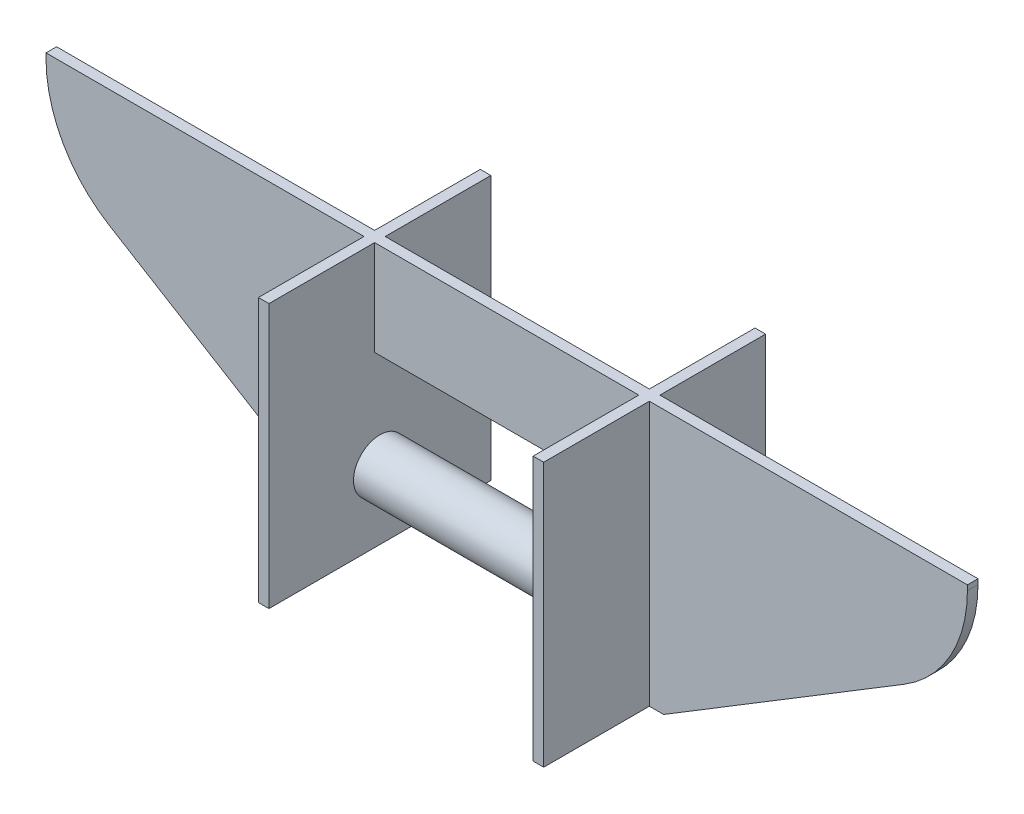
ISO-10303-21;
HEADER;
FILE_DESCRIPTION(('STEP AP214'),'2;1');
FILE_NAME('part.step','',(''),(''),'','','');
FILE_SCHEMA(('AUTOMOTIVE_DESIGN { 1 0 10303 214 1 1 1 1 }'));
ENDSEC;
DATA;
#1=APPLICATION_CONTEXT('core data for automotive mechanical design processes');
#2=APPLICATION_PROTOCOL_DEFINITION('international standard','automotive_design',2000,#1);
#3=PRODUCT_CONTEXT('',#1,'mechanical');
#4=PRODUCT('Part','Part','',(#3));
#5=PRODUCT_RELATED_PRODUCT_CATEGORY('part','',(#4));
#6=PRODUCT_DEFINITION_FORMATION('','',#4);
#7=PRODUCT_DEFINITION_CONTEXT('part definition',#1,'design');
#8=PRODUCT_DEFINITION('design','',#6,#7);
#9=PRODUCT_DEFINITION_SHAPE('','',#8);
#10=(LENGTH_UNIT() NAMED_UNIT(*) SI_UNIT(.MILLI.,.METRE.));
#11=(NAMED_UNIT(*) PLANE_ANGLE_UNIT() SI_UNIT($,.RADIAN.));
#12=(NAMED_UNIT(*) SI_UNIT($,.STERADIAN.) SOLID_ANGLE_UNIT());
#13=UNCERTAINTY_MEASURE_WITH_UNIT(LENGTH_MEASURE(1.E-05),#10,'distance_accuracy_value','');
#14=(GEOMETRIC_REPRESENTATION_CONTEXT(3) GLOBAL_UNCERTAINTY_ASSIGNED_CONTEXT((#13)) GLOBAL_UNIT_ASSIGNED_CONTEXT((#10,
#11,#12)) REPRESENTATION_CONTEXT('',''));
#15=CARTESIAN_POINT('',(0.,0.,0.));
#16=DIRECTION('',(0.,0.,1.));
#17=DIRECTION('',(1.,0.,0.));
#18=AXIS2_PLACEMENT_3D('',#15,#16,#17);
#19=CARTESIAN_POINT('',(107.188,124.586514185444,-2.54));
#20=DIRECTION('',(0.,0.,1.));
#21=DIRECTION('',(1.,0.,0.));
#22=AXIS2_PLACEMENT_3D('',#19,#20,#21);
#23=PLANE('',#22);
#24=DIRECTION('',(-1.,0.,0.));
#25=VECTOR('',#24,1.);
#26=CARTESIAN_POINT('',(-272.288,127.,-2.54));
#27=LINE('',#26,#25);
#28=CARTESIAN_POINT('',(12.7,127.,-2.54));
#29=VERTEX_POINT('',#28);
#30=CARTESIAN_POINT('',(-114.3,127.,-2.54));
#31=VERTEX_POINT('',#30);
#32=EDGE_CURVE('E398',#29,#31,#27,.T.);
#33=ORIENTED_EDGE('',*,*,#32,.F.);
#34=DIRECTION('',(0.,-1.,0.));
#35=VECTOR('',#34,1.);
#36=CARTESIAN_POINT('',(12.7,124.586514185444,-2.54));
#37=LINE('',#36,#35);
#38=CARTESIAN_POINT('',(12.7,81.28,-2.54));
#39=VERTEX_POINT('',#38);
#40=EDGE_CURVE('E274',#29,#39,#37,.T.);
#41=ORIENTED_EDGE('',*,*,#40,.T.);
#42=DIRECTION('',(1.,0.,0.));
#43=VECTOR('',#42,1.);
#44=CARTESIAN_POINT('',(-114.3,81.28,-2.54));
#45=LINE('',#44,#43);
#46=CARTESIAN_POINT('',(-114.3,81.28,-2.54));
#47=VERTEX_POINT('',#46);
#48=EDGE_CURVE('E373',#47,#39,#45,.T.);
#49=ORIENTED_EDGE('',*,*,#48,.F.);
#50=DIRECTION('',(0.,1.,0.));
#51=VECTOR('',#50,1.);
#52=CARTESIAN_POINT('',(-114.3,124.586514185444,-2.54));
#53=LINE('',#52,#51);
#54=EDGE_CURVE('E333',#47,#31,#53,.T.);
#55=ORIENTED_EDGE('',*,*,#54,.T.);
#56=EDGE_LOOP('',(#33,#41,#49,#55));
#57=FACE_BOUND('',#56,.T.);
#58=ADVANCED_FACE('F39',(#57),#23,.F.);
#59=CARTESIAN_POINT('',(107.188,124.586514185444,2.54));
#60=DIRECTION('',(0.,0.,1.));
#61=DIRECTION('',(1.,0.,0.));
#62=AXIS2_PLACEMENT_3D('',#59,#60,#61);
#63=PLANE('',#62);
#64=DIRECTION('',(0.,-1.,0.));
#65=VECTOR('',#64,1.);
#66=CARTESIAN_POINT('',(12.7,124.586514185444,2.54));
#67=LINE('',#66,#65);
#68=CARTESIAN_POINT('',(12.7,127.,2.54));
#69=VERTEX_POINT('',#68);
#70=CARTESIAN_POINT('',(12.7,81.28,2.54));
#71=VERTEX_POINT('',#70);
#72=EDGE_CURVE('E55',#69,#71,#67,.T.);
#73=ORIENTED_EDGE('',*,*,#72,.F.);
#74=DIRECTION('',(-1.,0.,0.));
#75=VECTOR('',#74,1.);
#76=CARTESIAN_POINT('',(-272.288,127.,2.54));
#77=LINE('',#76,#75);
#78=CARTESIAN_POINT('',(-114.3,127.,2.54));
#79=VERTEX_POINT('',#78);
#80=EDGE_CURVE('E358',#69,#79,#77,.T.);
#81=ORIENTED_EDGE('',*,*,#80,.T.);
#82=DIRECTION('',(0.,1.,0.));
#83=VECTOR('',#82,1.);
#84=CARTESIAN_POINT('',(-114.3,124.586514185444,2.54));
#85=LINE('',#84,#83);
#86=CARTESIAN_POINT('',(-114.3,81.28,2.54));
#87=VERTEX_POINT('',#86);
#88=EDGE_CURVE('E11',#87,#79,#85,.T.);
#89=ORIENTED_EDGE('',*,*,#88,.F.);
#90=DIRECTION('',(1.,0.,0.));
#91=VECTOR('',#90,1.);
#92=CARTESIAN_POINT('',(-114.3,81.28,2.54));
#93=LINE('',#92,#91);
#94=EDGE_CURVE('E337',#87,#71,#93,.T.);
#95=ORIENTED_EDGE('',*,*,#94,.T.);
#96=EDGE_LOOP('',(#73,#81,#89,#95));
#97=FACE_BOUND('',#96,.T.);
#98=ADVANCED_FACE('F501',(#97),#63,.T.);
#99=DIRECTION('',(1.,0.,0.));
#100=VECTOR('',#99,1.);
#101=CARTESIAN_POINT('',(12.7,0.,-2.54));
#102=LINE('',#101,#100);
#103=CARTESIAN_POINT('',(17.78,0.,-2.54));
#104=VERTEX_POINT('',#103);
#105=CARTESIAN_POINT('',(24.638,0.,-2.54));
#106=VERTEX_POINT('',#105);
#107=EDGE_CURVE('E377',#104,#106,#102,.T.);
#108=ORIENTED_EDGE('',*,*,#107,.F.);
#109=DIRECTION('',(0.,1.,0.));
#110=VECTOR('',#109,1.);
#111=CARTESIAN_POINT('',(17.78,124.586514185444,-2.54));
#112=LINE('',#111,#110);
#113=CARTESIAN_POINT('',(17.78,127.,-2.54));
#114=VERTEX_POINT('',#113);
#115=EDGE_CURVE('E280',#104,#114,#112,.T.);
#116=ORIENTED_EDGE('',*,*,#115,.T.);
#117=CARTESIAN_POINT('',(170.688,127.,-2.54));
#118=VERTEX_POINT('',#117);
#119=EDGE_CURVE('E393',#118,#114,#27,.T.);
#120=ORIENTED_EDGE('',*,*,#119,.F.);
#121=DIRECTION('',(0.,1.,0.));
#122=VECTOR('',#121,1.);
#123=CARTESIAN_POINT('',(170.688,124.586514185444,-2.54));
#124=LINE('',#123,#122);
#125=CARTESIAN_POINT('',(170.688,124.586514185444,-2.54));
#126=VERTEX_POINT('',#125);
#127=EDGE_CURVE('E388',#126,#118,#124,.T.);
#128=ORIENTED_EDGE('',*,*,#127,.F.);
#129=CARTESIAN_POINT('',(107.188,124.586514185444,-2.54));
#130=DIRECTION('',(0.,0.,1.));
#131=DIRECTION('',(1.,0.,0.));
#132=AXIS2_PLACEMENT_3D('',#129,#130,#131);
#133=CIRCLE('',#132,63.5);
#134=CARTESIAN_POINT('',(140.20463112788,70.3449059039269,-2.54));
#135=VERTEX_POINT('',#134);
#136=EDGE_CURVE('E384',#135,#126,#133,.T.);
#137=ORIENTED_EDGE('',*,*,#136,.F.);
#138=DIRECTION('',(0.854198555614438,0.519946946895746,0.));
#139=VECTOR('',#138,1.);
#140=CARTESIAN_POINT('',(24.638,0.,-2.54));
#141=LINE('',#140,#139);
#142=EDGE_CURVE('E380',#106,#135,#141,.T.);
#143=ORIENTED_EDGE('',*,*,#142,.F.);
#144=EDGE_LOOP('',(#108,#116,#120,#128,#137,#143));
#145=FACE_BOUND('',#144,.T.);
#146=ADVANCED_FACE('F525',(#145),#23,.F.);
#147=DIRECTION('',(0.,1.,0.));
#148=VECTOR('',#147,1.);
#149=CARTESIAN_POINT('',(17.78,124.586514185444,2.54));
#150=LINE('',#149,#148);
#151=CARTESIAN_POINT('',(17.78,0.,2.54));
#152=VERTEX_POINT('',#151);
#153=CARTESIAN_POINT('',(17.78,127.,2.54));
#154=VERTEX_POINT('',#153);
#155=EDGE_CURVE('E277',#152,#154,#150,.T.);
#156=ORIENTED_EDGE('',*,*,#155,.F.);
#157=DIRECTION('',(1.,0.,0.));
#158=VECTOR('',#157,1.);
#159=CARTESIAN_POINT('',(12.7,0.,2.54));
#160=LINE('',#159,#158);
#161=CARTESIAN_POINT('',(24.638,0.,2.54));
#162=VERTEX_POINT('',#161);
#163=EDGE_CURVE('E340',#152,#162,#160,.T.);
#164=ORIENTED_EDGE('',*,*,#163,.T.);
#165=DIRECTION('',(0.854198555614438,0.519946946895746,0.));
#166=VECTOR('',#165,1.);
#167=CARTESIAN_POINT('',(24.638,0.,2.54));
#168=LINE('',#167,#166);
#169=CARTESIAN_POINT('',(140.20463112788,70.3449059039269,2.54));
#170=VERTEX_POINT('',#169);
#171=EDGE_CURVE('E343',#162,#170,#168,.T.);
#172=ORIENTED_EDGE('',*,*,#171,.T.);
#173=CARTESIAN_POINT('',(107.188,124.586514185444,2.54));
#174=DIRECTION('',(0.,0.,1.));
#175=DIRECTION('',(1.,0.,0.));
#176=AXIS2_PLACEMENT_3D('',#173,#174,#175);
#177=CIRCLE('',#176,63.5);
#178=CARTESIAN_POINT('',(170.688,124.586514185444,2.54));
#179=VERTEX_POINT('',#178);
#180=EDGE_CURVE('E347',#170,#179,#177,.T.);
#181=ORIENTED_EDGE('',*,*,#180,.T.);
#182=DIRECTION('',(0.,1.,0.));
#183=VECTOR('',#182,1.);
#184=CARTESIAN_POINT('',(170.688,124.586514185444,2.54));
#185=LINE('',#184,#183);
#186=CARTESIAN_POINT('',(170.688,127.,2.54));
#187=VERTEX_POINT('',#186);
#188=EDGE_CURVE('E351',#179,#187,#185,.T.);
#189=ORIENTED_EDGE('',*,*,#188,.T.);
#190=EDGE_CURVE('E63',#187,#154,#77,.T.);
#191=ORIENTED_EDGE('',*,*,#190,.T.);
#192=EDGE_LOOP('',(#156,#164,#172,#181,#189,#191));
#193=FACE_BOUND('',#192,.T.);
#194=ADVANCED_FACE('F529',(#193),#63,.T.);
#195=CARTESIAN_POINT('',(-114.3,0.,-2.54));
#196=DIRECTION('',(1.,0.,0.));
#197=DIRECTION('',(0.,0.,-1.));
#198=AXIS2_PLACEMENT_3D('',#195,#196,#197);
#199=PLANE('',#198);
#200=CARTESIAN_POINT('',(-114.3,33.02,0.));
#201=DIRECTION('',(1.,0.,0.));
#202=DIRECTION('',(0.,0.,-1.));
#203=AXIS2_PLACEMENT_3D('',#200,#201,#202);
#204=CIRCLE('',#203,12.7);
#205=CARTESIAN_POINT('',(-114.3,33.02,-12.7));
#206=VERTEX_POINT('',#205);
#207=EDGE_CURVE('E235',#206,#206,#204,.T.);
#208=ORIENTED_EDGE('',*,*,#207,.F.);
#209=EDGE_LOOP('',(#208));
#210=FACE_BOUND('',#209,.T.);
#211=DIRECTION('',(0.,0.,1.));
#212=VECTOR('',#211,1.);
#213=CARTESIAN_POINT('',(-114.3,81.28,-2.54));
#214=LINE('',#213,#212);
#215=EDGE_CURVE('E414',#47,#87,#214,.T.);
#216=ORIENTED_EDGE('',*,*,#215,.T.);
#217=ORIENTED_EDGE('',*,*,#88,.T.);
#218=DIRECTION('',(0.,0.,1.));
#219=VECTOR('',#218,1.);
#220=CARTESIAN_POINT('',(-114.3,127.,-53.34));
#221=LINE('',#220,#219);
#222=CARTESIAN_POINT('',(-114.3,127.,53.34));
#223=VERTEX_POINT('',#222);
#224=EDGE_CURVE('E316',#79,#223,#221,.T.);
#225=ORIENTED_EDGE('',*,*,#224,.T.);
#226=DIRECTION('',(0.,1.,0.));
#227=VECTOR('',#226,1.);
#228=CARTESIAN_POINT('',(-114.3,0.,53.34));
#229=LINE('',#228,#227);
#230=CARTESIAN_POINT('',(-114.3,0.,53.34));
#231=VERTEX_POINT('',#230);
#232=EDGE_CURVE('E284',#231,#223,#229,.T.);
#233=ORIENTED_EDGE('',*,*,#232,.F.);
#234=DIRECTION('',(0.,0.,1.));
#235=VECTOR('',#234,1.);
#236=CARTESIAN_POINT('',(-114.3,0.,-2.54));
#237=LINE('',#236,#235);
#238=CARTESIAN_POINT('',(-114.3,0.,-53.34));
#239=VERTEX_POINT('',#238);
#240=EDGE_CURVE('E415',#239,#231,#237,.T.);
#241=ORIENTED_EDGE('',*,*,#240,.F.);
#242=DIRECTION('',(0.,1.,0.));
#243=VECTOR('',#242,1.);
#244=CARTESIAN_POINT('',(-114.3,0.,-53.34));
#245=LINE('',#244,#243);
#246=CARTESIAN_POINT('',(-114.3,127.,-53.34));
#247=VERTEX_POINT('',#246);
#248=EDGE_CURVE('E300',#239,#247,#245,.T.);
#249=ORIENTED_EDGE('',*,*,#248,.T.);
#250=EDGE_CURVE('E326',#247,#31,#221,.T.);
#251=ORIENTED_EDGE('',*,*,#250,.T.);
#252=ORIENTED_EDGE('',*,*,#54,.F.);
#253=EDGE_LOOP('',(#216,#217,#225,#233,#241,#249,#251,#252));
#254=FACE_BOUND('',#253,.T.);
#255=ADVANCED_FACE('F41',(#210,#254),#199,.T.);
#256=CARTESIAN_POINT('',(-114.3,0.,-2.54));
#257=DIRECTION('',(0.,-1.,0.));
#258=DIRECTION('',(1.,0.,0.));
#259=AXIS2_PLACEMENT_3D('',#256,#257,#258);
#260=PLANE('',#259);
#261=DIRECTION('',(1.,0.,0.));
#262=VECTOR('',#261,1.);
#263=CARTESIAN_POINT('',(-114.3,0.,-2.54));
#264=LINE('',#263,#262);
#265=CARTESIAN_POINT('',(-126.238,0.,-2.54));
#266=VERTEX_POINT('',#265);
#267=CARTESIAN_POINT('',(-119.38,0.,-2.54));
#268=VERTEX_POINT('',#267);
#269=EDGE_CURVE('E410',#266,#268,#264,.T.);
#270=ORIENTED_EDGE('',*,*,#269,.T.);
#271=DIRECTION('',(0.,0.,1.));
#272=VECTOR('',#271,1.);
#273=CARTESIAN_POINT('',(-119.38,0.,-53.34));
#274=LINE('',#273,#272);
#275=CARTESIAN_POINT('',(-119.38,0.,-53.34));
#276=VERTEX_POINT('',#275);
#277=EDGE_CURVE('E317',#276,#268,#274,.T.);
#278=ORIENTED_EDGE('',*,*,#277,.F.);
#279=DIRECTION('',(1.,0.,0.));
#280=VECTOR('',#279,1.);
#281=CARTESIAN_POINT('',(-114.3,0.,-53.34));
#282=LINE('',#281,#280);
#283=EDGE_CURVE('E312',#276,#239,#282,.T.);
#284=ORIENTED_EDGE('',*,*,#283,.T.);
#285=ORIENTED_EDGE('',*,*,#240,.T.);
#286=DIRECTION('',(1.,0.,0.));
#287=VECTOR('',#286,1.);
#288=CARTESIAN_POINT('',(-114.3,0.,53.34));
#289=LINE('',#288,#287);
#290=CARTESIAN_POINT('',(-119.38,0.,53.34));
#291=VERTEX_POINT('',#290);
#292=EDGE_CURVE('E296',#291,#231,#289,.T.);
#293=ORIENTED_EDGE('',*,*,#292,.F.);
#294=CARTESIAN_POINT('',(-119.38,0.,2.54));
#295=VERTEX_POINT('',#294);
#296=EDGE_CURVE('E321',#295,#291,#274,.T.);
#297=ORIENTED_EDGE('',*,*,#296,.F.);
#298=DIRECTION('',(1.,0.,0.));
#299=VECTOR('',#298,1.);
#300=CARTESIAN_POINT('',(-114.3,0.,2.54));
#301=LINE('',#300,#299);
#302=CARTESIAN_POINT('',(-126.238,0.,2.54));
#303=VERTEX_POINT('',#302);
#304=EDGE_CURVE('E370',#303,#295,#301,.T.);
#305=ORIENTED_EDGE('',*,*,#304,.F.);
#306=DIRECTION('',(0.,0.,1.));
#307=VECTOR('',#306,1.);
#308=CARTESIAN_POINT('',(-126.238,0.,-2.54));
#309=LINE('',#308,#307);
#310=EDGE_CURVE('E418',#266,#303,#309,.T.);
#311=ORIENTED_EDGE('',*,*,#310,.F.);
#312=EDGE_LOOP('',(#270,#278,#284,#285,#293,#297,#305,#311));
#313=FACE_BOUND('',#312,.T.);
#314=ADVANCED_FACE('F459',(#313),#260,.T.);
#315=CARTESIAN_POINT('',(-126.238,0.,-2.54));
#316=DIRECTION('',(-0.519946946895745,-0.854198555614438,0.));
#317=DIRECTION('',(0.854198555614438,-0.519946946895745,0.));
#318=AXIS2_PLACEMENT_3D('',#315,#316,#317);
#319=PLANE('',#318);
#320=ORIENTED_EDGE('',*,*,#310,.T.);
#321=DIRECTION('',(0.854198555614438,-0.519946946895745,0.));
#322=VECTOR('',#321,1.);
#323=CARTESIAN_POINT('',(-126.238,0.,2.54));
#324=LINE('',#323,#322);
#325=CARTESIAN_POINT('',(-241.80463112788,70.3449059039269,2.54));
#326=VERTEX_POINT('',#325);
#327=EDGE_CURVE('E366',#326,#303,#324,.T.);
#328=ORIENTED_EDGE('',*,*,#327,.F.);
#329=DIRECTION('',(0.,0.,1.));
#330=VECTOR('',#329,1.);
#331=CARTESIAN_POINT('',(-241.80463112788,70.3449059039269,-2.54));
#332=LINE('',#331,#330);
#333=CARTESIAN_POINT('',(-241.80463112788,70.3449059039269,-2.54));
#334=VERTEX_POINT('',#333);
#335=EDGE_CURVE('E421',#334,#326,#332,.T.);
#336=ORIENTED_EDGE('',*,*,#335,.F.);
#337=DIRECTION('',(0.854198555614438,-0.519946946895745,0.));
#338=VECTOR('',#337,1.);
#339=CARTESIAN_POINT('',(-126.238,0.,-2.54));
#340=LINE('',#339,#338);
#341=EDGE_CURVE('E406',#334,#266,#340,.T.);
#342=ORIENTED_EDGE('',*,*,#341,.T.);
#343=EDGE_LOOP('',(#320,#328,#336,#342));
#344=FACE_BOUND('',#343,.T.);
#345=ADVANCED_FACE('F564',(#344),#319,.T.);
#346=CARTESIAN_POINT('',(-208.788,124.586514185444,-2.54));
#347=DIRECTION('',(0.,0.,1.));
#348=DIRECTION('',(1.,0.,0.));
#349=AXIS2_PLACEMENT_3D('',#346,#347,#348);
#350=CYLINDRICAL_SURFACE('',#349,63.5);
#351=ORIENTED_EDGE('',*,*,#335,.T.);
#352=CARTESIAN_POINT('',(-208.788,124.586514185444,2.54));
#353=DIRECTION('',(0.,0.,1.));
#354=DIRECTION('',(-1.,0.,0.));
#355=AXIS2_PLACEMENT_3D('',#352,#353,#354);
#356=CIRCLE('',#355,63.5);
#357=CARTESIAN_POINT('',(-272.288,124.586514185444,2.54));
#358=VERTEX_POINT('',#357);
#359=EDGE_CURVE('E362',#358,#326,#356,.T.);
#360=ORIENTED_EDGE('',*,*,#359,.F.);
#361=DIRECTION('',(0.,0.,1.));
#362=VECTOR('',#361,1.);
#363=CARTESIAN_POINT('',(-272.288,124.586514185444,-2.54));
#364=LINE('',#363,#362);
#365=CARTESIAN_POINT('',(-272.288,124.586514185444,-2.54));
#366=VERTEX_POINT('',#365);
#367=EDGE_CURVE('E424',#366,#358,#364,.T.);
#368=ORIENTED_EDGE('',*,*,#367,.F.);
#369=CARTESIAN_POINT('',(-208.788,124.586514185444,-2.54));
#370=DIRECTION('',(0.,0.,1.));
#371=DIRECTION('',(-1.,0.,0.));
#372=AXIS2_PLACEMENT_3D('',#369,#370,#371);
#373=CIRCLE('',#372,63.5);
#374=EDGE_CURVE('E402',#366,#334,#373,.T.);
#375=ORIENTED_EDGE('',*,*,#374,.T.);
#376=EDGE_LOOP('',(#351,#360,#368,#375));
#377=FACE_BOUND('',#376,.T.);
#378=ADVANCED_FACE('F495',(#377),#350,.T.);
#379=CARTESIAN_POINT('',(-272.288,124.586514185444,-2.54));
#380=DIRECTION('',(-1.,0.,0.));
#381=DIRECTION('',(0.,0.,1.));
#382=AXIS2_PLACEMENT_3D('',#379,#380,#381);
#383=PLANE('',#382);
#384=ORIENTED_EDGE('',*,*,#367,.T.);
#385=DIRECTION('',(0.,-1.,0.));
#386=VECTOR('',#385,1.);
#387=CARTESIAN_POINT('',(-272.288,124.586514185444,2.54));
#388=LINE('',#387,#386);
#389=CARTESIAN_POINT('',(-272.288,127.,2.54));
#390=VERTEX_POINT('',#389);
#391=EDGE_CURVE('E357',#390,#358,#388,.T.);
#392=ORIENTED_EDGE('',*,*,#391,.F.);
#393=DIRECTION('',(0.,0.,1.));
#394=VECTOR('',#393,1.);
#395=CARTESIAN_POINT('',(-272.288,127.,-2.54));
#396=LINE('',#395,#394);
#397=CARTESIAN_POINT('',(-272.288,127.,-2.54));
#398=VERTEX_POINT('',#397);
#399=EDGE_CURVE('E427',#398,#390,#396,.T.);
#400=ORIENTED_EDGE('',*,*,#399,.F.);
#401=DIRECTION('',(0.,-1.,0.));
#402=VECTOR('',#401,1.);
#403=CARTESIAN_POINT('',(-272.288,124.586514185444,-2.54));
#404=LINE('',#403,#402);
#405=EDGE_CURVE('E397',#398,#366,#404,.T.);
#406=ORIENTED_EDGE('',*,*,#405,.T.);
#407=EDGE_LOOP('',(#384,#392,#400,#406));
#408=FACE_BOUND('',#407,.T.);
#409=ADVANCED_FACE('F489',(#408),#383,.T.);
#410=CARTESIAN_POINT('',(-272.288,127.,-2.54));
#411=DIRECTION('',(0.,1.,0.));
#412=DIRECTION('',(-1.,0.,0.));
#413=AXIS2_PLACEMENT_3D('',#410,#411,#412);
#414=PLANE('',#413);
#415=ORIENTED_EDGE('',*,*,#119,.T.);
#416=DIRECTION('',(0.,0.,1.));
#417=VECTOR('',#416,1.);
#418=CARTESIAN_POINT('',(17.78,127.,-53.34));
#419=LINE('',#418,#417);
#420=CARTESIAN_POINT('',(17.78,127.,-53.34));
#421=VERTEX_POINT('',#420);
#422=EDGE_CURVE('E265',#421,#114,#419,.T.);
#423=ORIENTED_EDGE('',*,*,#422,.F.);
#424=DIRECTION('',(-1.,0.,0.));
#425=VECTOR('',#424,1.);
#426=CARTESIAN_POINT('',(12.7,127.,-53.34));
#427=LINE('',#426,#425);
#428=CARTESIAN_POINT('',(12.7,127.,-53.34));
#429=VERTEX_POINT('',#428);
#430=EDGE_CURVE('E256',#421,#429,#427,.T.);
#431=ORIENTED_EDGE('',*,*,#430,.T.);
#432=DIRECTION('',(0.,0.,1.));
#433=VECTOR('',#432,1.);
#434=CARTESIAN_POINT('',(12.7,127.,-53.34));
#435=LINE('',#434,#433);
#436=EDGE_CURVE('E260',#429,#29,#435,.T.);
#437=ORIENTED_EDGE('',*,*,#436,.T.);
#438=ORIENTED_EDGE('',*,*,#32,.T.);
#439=ORIENTED_EDGE('',*,*,#250,.F.);
#440=DIRECTION('',(-1.,0.,0.));
#441=VECTOR('',#440,1.);
#442=CARTESIAN_POINT('',(-114.3,127.,-53.34));
#443=LINE('',#442,#441);
#444=CARTESIAN_POINT('',(-119.38,127.,-53.34));
#445=VERTEX_POINT('',#444);
#446=EDGE_CURVE('E304',#247,#445,#443,.T.);
#447=ORIENTED_EDGE('',*,*,#446,.T.);
#448=DIRECTION('',(0.,0.,1.));
#449=VECTOR('',#448,1.);
#450=CARTESIAN_POINT('',(-119.38,127.,-53.34));
#451=LINE('',#450,#449);
#452=CARTESIAN_POINT('',(-119.38,127.,-2.54));
#453=VERTEX_POINT('',#452);
#454=EDGE_CURVE('E322',#445,#453,#451,.T.);
#455=ORIENTED_EDGE('',*,*,#454,.T.);
#456=EDGE_CURVE('E392',#453,#398,#27,.T.);
#457=ORIENTED_EDGE('',*,*,#456,.T.);
#458=ORIENTED_EDGE('',*,*,#399,.T.);
#459=CARTESIAN_POINT('',(-119.38,127.,2.54));
#460=VERTEX_POINT('',#459);
#461=EDGE_CURVE('E354',#460,#390,#77,.T.);
#462=ORIENTED_EDGE('',*,*,#461,.F.);
#463=CARTESIAN_POINT('',(-119.38,127.,53.34));
#464=VERTEX_POINT('',#463);
#465=EDGE_CURVE('E325',#460,#464,#451,.T.);
#466=ORIENTED_EDGE('',*,*,#465,.T.);
#467=DIRECTION('',(-1.,0.,0.));
#468=VECTOR('',#467,1.);
#469=CARTESIAN_POINT('',(-114.3,127.,53.34));
#470=LINE('',#469,#468);
#471=EDGE_CURVE('E288',#223,#464,#470,.T.);
#472=ORIENTED_EDGE('',*,*,#471,.F.);
#473=ORIENTED_EDGE('',*,*,#224,.F.);
#474=ORIENTED_EDGE('',*,*,#80,.F.);
#475=CARTESIAN_POINT('',(12.7,127.,53.34));
#476=VERTEX_POINT('',#475);
#477=EDGE_CURVE('E264',#69,#476,#435,.T.);
#478=ORIENTED_EDGE('',*,*,#477,.T.);
#479=DIRECTION('',(-1.,0.,0.));
#480=VECTOR('',#479,1.);
#481=CARTESIAN_POINT('',(12.7,127.,53.34));
#482=LINE('',#481,#480);
#483=CARTESIAN_POINT('',(17.78,127.,53.34));
#484=VERTEX_POINT('',#483);
#485=EDGE_CURVE('E233',#484,#476,#482,.T.);
#486=ORIENTED_EDGE('',*,*,#485,.F.);
#487=EDGE_CURVE('E268',#154,#484,#419,.T.);
#488=ORIENTED_EDGE('',*,*,#487,.F.);
#489=ORIENTED_EDGE('',*,*,#190,.F.);
#490=DIRECTION('',(0.,0.,1.));
#491=VECTOR('',#490,1.);
#492=CARTESIAN_POINT('',(170.688,127.,-2.54));
#493=LINE('',#492,#491);
#494=EDGE_CURVE('E431',#118,#187,#493,.T.);
#495=ORIENTED_EDGE('',*,*,#494,.F.);
#496=EDGE_LOOP('',(#415,#423,#431,#437,#438,#439,#447,#455,#457,#458,#462,#466,#472,#473,#474,
#478,#486,#488,#489,#495));
#497=FACE_BOUND('',#496,.T.);
#498=ADVANCED_FACE('F470',(#497),#414,.T.);
#499=CARTESIAN_POINT('',(170.688,124.586514185444,-2.54));
#500=DIRECTION('',(1.,0.,0.));
#501=DIRECTION('',(0.,0.,-1.));
#502=AXIS2_PLACEMENT_3D('',#499,#500,#501);
#503=PLANE('',#502);
#504=ORIENTED_EDGE('',*,*,#494,.T.);
#505=ORIENTED_EDGE('',*,*,#188,.F.);
#506=DIRECTION('',(0.,0.,1.));
#507=VECTOR('',#506,1.);
#508=CARTESIAN_POINT('',(170.688,124.586514185444,-2.54));
#509=LINE('',#508,#507);
#510=EDGE_CURVE('E434',#126,#179,#509,.T.);
#511=ORIENTED_EDGE('',*,*,#510,.F.);
#512=ORIENTED_EDGE('',*,*,#127,.T.);
#513=EDGE_LOOP('',(#504,#505,#511,#512));
#514=FACE_BOUND('',#513,.T.);
#515=ADVANCED_FACE('F553',(#514),#503,.T.);
#516=CARTESIAN_POINT('',(107.188,124.586514185444,-2.54));
#517=DIRECTION('',(0.,0.,1.));
#518=DIRECTION('',(1.,0.,0.));
#519=AXIS2_PLACEMENT_3D('',#516,#517,#518);
#520=CYLINDRICAL_SURFACE('',#519,63.5);
#521=ORIENTED_EDGE('',*,*,#510,.T.);
#522=ORIENTED_EDGE('',*,*,#180,.F.);
#523=DIRECTION('',(0.,0.,1.));
#524=VECTOR('',#523,1.);
#525=CARTESIAN_POINT('',(140.20463112788,70.3449059039269,-2.54));
#526=LINE('',#525,#524);
#527=EDGE_CURVE('E437',#135,#170,#526,.T.);
#528=ORIENTED_EDGE('',*,*,#527,.F.);
#529=ORIENTED_EDGE('',*,*,#136,.T.);
#530=EDGE_LOOP('',(#521,#522,#528,#529));
#531=FACE_BOUND('',#530,.T.);
#532=ADVANCED_FACE('F549',(#531),#520,.T.);
#533=CARTESIAN_POINT('',(24.638,0.,-2.54));
#534=DIRECTION('',(0.519946946895746,-0.854198555614438,0.));
#535=DIRECTION('',(0.854198555614438,0.519946946895746,0.));
#536=AXIS2_PLACEMENT_3D('',#533,#534,#535);
#537=PLANE('',#536);
#538=ORIENTED_EDGE('',*,*,#527,.T.);
#539=ORIENTED_EDGE('',*,*,#171,.F.);
#540=DIRECTION('',(0.,0.,1.));
#541=VECTOR('',#540,1.);
#542=CARTESIAN_POINT('',(24.638,0.,-2.54));
#543=LINE('',#542,#541);
#544=EDGE_CURVE('E216',#106,#162,#543,.T.);
#545=ORIENTED_EDGE('',*,*,#544,.F.);
#546=ORIENTED_EDGE('',*,*,#142,.T.);
#547=EDGE_LOOP('',(#538,#539,#545,#546));
#548=FACE_BOUND('',#547,.T.);
#549=ADVANCED_FACE('F546',(#548),#537,.T.);
#550=CARTESIAN_POINT('',(12.7,0.,-2.54));
#551=DIRECTION('',(0.,-1.,0.));
#552=DIRECTION('',(1.,0.,0.));
#553=AXIS2_PLACEMENT_3D('',#550,#551,#552);
#554=PLANE('',#553);
#555=ORIENTED_EDGE('',*,*,#163,.F.);
#556=DIRECTION('',(0.,0.,1.));
#557=VECTOR('',#556,1.);
#558=CARTESIAN_POINT('',(17.78,0.,-53.34));
#559=LINE('',#558,#557);
#560=CARTESIAN_POINT('',(17.78,0.,53.34));
#561=VERTEX_POINT('',#560);
#562=EDGE_CURVE('E223',#152,#561,#559,.T.);
#563=ORIENTED_EDGE('',*,*,#562,.T.);
#564=DIRECTION('',(1.,0.,0.));
#565=VECTOR('',#564,1.);
#566=CARTESIAN_POINT('',(12.7,0.,53.34));
#567=LINE('',#566,#565);
#568=CARTESIAN_POINT('',(12.7,0.,53.34));
#569=VERTEX_POINT('',#568);
#570=EDGE_CURVE('E220',#569,#561,#567,.T.);
#571=ORIENTED_EDGE('',*,*,#570,.F.);
#572=DIRECTION('',(0.,0.,1.));
#573=VECTOR('',#572,1.);
#574=CARTESIAN_POINT('',(12.7,0.,-2.54));
#575=LINE('',#574,#573);
#576=CARTESIAN_POINT('',(12.7,0.,-53.34));
#577=VERTEX_POINT('',#576);
#578=EDGE_CURVE('E204',#577,#569,#575,.T.);
#579=ORIENTED_EDGE('',*,*,#578,.F.);
#580=DIRECTION('',(1.,0.,0.));
#581=VECTOR('',#580,1.);
#582=CARTESIAN_POINT('',(12.7,0.,-53.34));
#583=LINE('',#582,#581);
#584=CARTESIAN_POINT('',(17.78,0.,-53.34));
#585=VERTEX_POINT('',#584);
#586=EDGE_CURVE('E249',#577,#585,#583,.T.);
#587=ORIENTED_EDGE('',*,*,#586,.T.);
#588=EDGE_CURVE('E269',#585,#104,#559,.T.);
#589=ORIENTED_EDGE('',*,*,#588,.T.);
#590=ORIENTED_EDGE('',*,*,#107,.T.);
#591=ORIENTED_EDGE('',*,*,#544,.T.);
#592=EDGE_LOOP('',(#555,#563,#571,#579,#587,#589,#590,#591));
#593=FACE_BOUND('',#592,.T.);
#594=ADVANCED_FACE('F221',(#593),#554,.T.);
#595=CARTESIAN_POINT('',(12.7,0.,-2.54));
#596=DIRECTION('',(-1.,0.,0.));
#597=DIRECTION('',(0.,-1.,0.));
#598=AXIS2_PLACEMENT_3D('',#595,#596,#597);
#599=PLANE('',#598);
#600=CARTESIAN_POINT('',(12.7,33.02,0.));
#601=DIRECTION('',(-1.,0.,0.));
#602=DIRECTION('',(0.,-1.,0.));
#603=AXIS2_PLACEMENT_3D('',#600,#601,#602);
#604=CIRCLE('',#603,12.7);
#605=CARTESIAN_POINT('',(12.7,20.32,0.));
#606=VERTEX_POINT('',#605);
#607=EDGE_CURVE('E239',#606,#606,#604,.T.);
#608=ORIENTED_EDGE('',*,*,#607,.F.);
#609=EDGE_LOOP('',(#608));
#610=FACE_BOUND('',#609,.T.);
#611=ORIENTED_EDGE('',*,*,#578,.T.);
#612=DIRECTION('',(0.,-1.,0.));
#613=VECTOR('',#612,1.);
#614=CARTESIAN_POINT('',(12.7,0.,53.34));
#615=LINE('',#614,#613);
#616=EDGE_CURVE('E209',#476,#569,#615,.T.);
#617=ORIENTED_EDGE('',*,*,#616,.F.);
#618=ORIENTED_EDGE('',*,*,#477,.F.);
#619=ORIENTED_EDGE('',*,*,#72,.T.);
#620=DIRECTION('',(0.,0.,1.));
#621=VECTOR('',#620,1.);
#622=CARTESIAN_POINT('',(12.7,81.28,-2.54));
#623=LINE('',#622,#621);
#624=EDGE_CURVE('E217',#39,#71,#623,.T.);
#625=ORIENTED_EDGE('',*,*,#624,.F.);
#626=ORIENTED_EDGE('',*,*,#40,.F.);
#627=ORIENTED_EDGE('',*,*,#436,.F.);
#628=DIRECTION('',(0.,-1.,0.));
#629=VECTOR('',#628,1.);
#630=CARTESIAN_POINT('',(12.7,0.,-53.34));
#631=LINE('',#630,#629);
#632=EDGE_CURVE('E211',#429,#577,#631,.T.);
#633=ORIENTED_EDGE('',*,*,#632,.T.);
#634=EDGE_LOOP('',(#611,#617,#618,#619,#625,#626,#627,#633));
#635=FACE_BOUND('',#634,.T.);
#636=ADVANCED_FACE('F206',(#610,#635),#599,.T.);
#637=CARTESIAN_POINT('',(-114.3,81.28,-2.54));
#638=DIRECTION('',(0.,-1.,0.));
#639=DIRECTION('',(1.,0.,0.));
#640=AXIS2_PLACEMENT_3D('',#637,#638,#639);
#641=PLANE('',#640);
#642=ORIENTED_EDGE('',*,*,#624,.T.);
#643=ORIENTED_EDGE('',*,*,#94,.F.);
#644=ORIENTED_EDGE('',*,*,#215,.F.);
#645=ORIENTED_EDGE('',*,*,#48,.T.);
#646=EDGE_LOOP('',(#642,#643,#644,#645));
#647=FACE_BOUND('',#646,.T.);
#648=ADVANCED_FACE('F477',(#647),#641,.T.);
#649=ORIENTED_EDGE('',*,*,#456,.F.);
#650=DIRECTION('',(0.,-1.,0.));
#651=VECTOR('',#650,1.);
#652=CARTESIAN_POINT('',(-119.38,124.586514185444,-2.54));
#653=LINE('',#652,#651);
#654=EDGE_CURVE('E320',#453,#268,#653,.T.);
#655=ORIENTED_EDGE('',*,*,#654,.T.);
#656=ORIENTED_EDGE('',*,*,#269,.F.);
#657=ORIENTED_EDGE('',*,*,#341,.F.);
#658=ORIENTED_EDGE('',*,*,#374,.F.);
#659=ORIENTED_EDGE('',*,*,#405,.F.);
#660=EDGE_LOOP('',(#649,#655,#656,#657,#658,#659));
#661=FACE_BOUND('',#660,.T.);
#662=ADVANCED_FACE('F491',(#661),#23,.F.);
#663=DIRECTION('',(0.,-1.,0.));
#664=VECTOR('',#663,1.);
#665=CARTESIAN_POINT('',(-119.38,124.586514185444,2.54));
#666=LINE('',#665,#664);
#667=EDGE_CURVE('E48',#460,#295,#666,.T.);
#668=ORIENTED_EDGE('',*,*,#667,.F.);
#669=ORIENTED_EDGE('',*,*,#461,.T.);
#670=ORIENTED_EDGE('',*,*,#391,.T.);
#671=ORIENTED_EDGE('',*,*,#359,.T.);
#672=ORIENTED_EDGE('',*,*,#327,.T.);
#673=ORIENTED_EDGE('',*,*,#304,.T.);
#674=EDGE_LOOP('',(#668,#669,#670,#671,#672,#673));
#675=FACE_BOUND('',#674,.T.);
#676=ADVANCED_FACE('F497',(#675),#63,.T.);
#677=CARTESIAN_POINT('',(0.,0.,53.34));
#678=DIRECTION('',(0.,0.,1.));
#679=DIRECTION('',(1.,0.,0.));
#680=AXIS2_PLACEMENT_3D('',#677,#678,#679);
#681=PLANE('',#680);
#682=ORIENTED_EDGE('',*,*,#232,.T.);
#683=ORIENTED_EDGE('',*,*,#471,.T.);
#684=DIRECTION('',(0.,-1.,0.));
#685=VECTOR('',#684,1.);
#686=CARTESIAN_POINT('',(-119.38,0.,53.34));
#687=LINE('',#686,#685);
#688=EDGE_CURVE('E292',#464,#291,#687,.T.);
#689=ORIENTED_EDGE('',*,*,#688,.T.);
#690=ORIENTED_EDGE('',*,*,#292,.T.);
#691=EDGE_LOOP('',(#682,#683,#689,#690));
#692=FACE_BOUND('',#691,.T.);
#693=ADVANCED_FACE('F506',(#692),#681,.T.);
#694=CARTESIAN_POINT('',(-119.38,0.,-53.34));
#695=DIRECTION('',(-1.,0.,0.));
#696=DIRECTION('',(0.,0.,1.));
#697=AXIS2_PLACEMENT_3D('',#694,#695,#696);
#698=PLANE('',#697);
#699=ORIENTED_EDGE('',*,*,#465,.F.);
#700=ORIENTED_EDGE('',*,*,#667,.T.);
#701=ORIENTED_EDGE('',*,*,#296,.T.);
#702=ORIENTED_EDGE('',*,*,#688,.F.);
#703=EDGE_LOOP('',(#699,#700,#701,#702));
#704=FACE_BOUND('',#703,.T.);
#705=ADVANCED_FACE('F453',(#704),#698,.T.);
#706=ORIENTED_EDGE('',*,*,#654,.F.);
#707=ORIENTED_EDGE('',*,*,#454,.F.);
#708=DIRECTION('',(0.,-1.,0.));
#709=VECTOR('',#708,1.);
#710=CARTESIAN_POINT('',(-119.38,0.,-53.34));
#711=LINE('',#710,#709);
#712=EDGE_CURVE('E308',#445,#276,#711,.T.);
#713=ORIENTED_EDGE('',*,*,#712,.T.);
#714=ORIENTED_EDGE('',*,*,#277,.T.);
#715=EDGE_LOOP('',(#706,#707,#713,#714));
#716=FACE_BOUND('',#715,.T.);
#717=ADVANCED_FACE('F514',(#716),#698,.T.);
#718=CARTESIAN_POINT('',(0.,0.,-53.34));
#719=DIRECTION('',(0.,0.,1.));
#720=DIRECTION('',(1.,0.,0.));
#721=AXIS2_PLACEMENT_3D('',#718,#719,#720);
#722=PLANE('',#721);
#723=ORIENTED_EDGE('',*,*,#248,.F.);
#724=ORIENTED_EDGE('',*,*,#283,.F.);
#725=ORIENTED_EDGE('',*,*,#712,.F.);
#726=ORIENTED_EDGE('',*,*,#446,.F.);
#727=EDGE_LOOP('',(#723,#724,#725,#726));
#728=FACE_BOUND('',#727,.T.);
#729=ADVANCED_FACE('F511',(#728),#722,.F.);
#730=CARTESIAN_POINT('',(0.,0.,53.34));
#731=DIRECTION('',(0.,0.,-1.));
#732=DIRECTION('',(-1.,0.,0.));
#733=AXIS2_PLACEMENT_3D('',#730,#731,#732);
#734=PLANE('',#733);
#735=ORIENTED_EDGE('',*,*,#616,.T.);
#736=ORIENTED_EDGE('',*,*,#570,.T.);
#737=DIRECTION('',(0.,1.,0.));
#738=VECTOR('',#737,1.);
#739=CARTESIAN_POINT('',(17.78,0.,53.34));
#740=LINE('',#739,#738);
#741=EDGE_CURVE('E228',#561,#484,#740,.T.);
#742=ORIENTED_EDGE('',*,*,#741,.T.);
#743=ORIENTED_EDGE('',*,*,#485,.T.);
#744=EDGE_LOOP('',(#735,#736,#742,#743));
#745=FACE_BOUND('',#744,.T.);
#746=ADVANCED_FACE('F231',(#745),#734,.F.);
#747=CARTESIAN_POINT('',(17.78,0.,-53.34));
#748=DIRECTION('',(1.,0.,0.));
#749=DIRECTION('',(0.,0.,-1.));
#750=AXIS2_PLACEMENT_3D('',#747,#748,#749);
#751=PLANE('',#750);
#752=ORIENTED_EDGE('',*,*,#562,.F.);
#753=ORIENTED_EDGE('',*,*,#155,.T.);
#754=ORIENTED_EDGE('',*,*,#487,.T.);
#755=ORIENTED_EDGE('',*,*,#741,.F.);
#756=EDGE_LOOP('',(#752,#753,#754,#755));
#757=FACE_BOUND('',#756,.T.);
#758=ADVANCED_FACE('F468',(#757),#751,.T.);
#759=ORIENTED_EDGE('',*,*,#115,.F.);
#760=ORIENTED_EDGE('',*,*,#588,.F.);
#761=DIRECTION('',(0.,1.,0.));
#762=VECTOR('',#761,1.);
#763=CARTESIAN_POINT('',(17.78,0.,-53.34));
#764=LINE('',#763,#762);
#765=EDGE_CURVE('E252',#585,#421,#764,.T.);
#766=ORIENTED_EDGE('',*,*,#765,.T.);
#767=ORIENTED_EDGE('',*,*,#422,.T.);
#768=EDGE_LOOP('',(#759,#760,#766,#767));
#769=FACE_BOUND('',#768,.T.);
#770=ADVANCED_FACE('F585',(#769),#751,.T.);
#771=CARTESIAN_POINT('',(0.,0.,-53.34));
#772=DIRECTION('',(0.,0.,-1.));
#773=DIRECTION('',(-1.,0.,0.));
#774=AXIS2_PLACEMENT_3D('',#771,#772,#773);
#775=PLANE('',#774);
#776=ORIENTED_EDGE('',*,*,#632,.F.);
#777=ORIENTED_EDGE('',*,*,#430,.F.);
#778=ORIENTED_EDGE('',*,*,#765,.F.);
#779=ORIENTED_EDGE('',*,*,#586,.F.);
#780=EDGE_LOOP('',(#776,#777,#778,#779));
#781=FACE_BOUND('',#780,.T.);
#782=ADVANCED_FACE('F579',(#781),#775,.T.);
#783=CARTESIAN_POINT('',(170.69,33.02,0.));
#784=DIRECTION('',(-1.,0.,0.));
#785=DIRECTION('',(0.,0.,1.));
#786=AXIS2_PLACEMENT_3D('',#783,#784,#785);
#787=CYLINDRICAL_SURFACE('',#786,12.7);
#788=ORIENTED_EDGE('',*,*,#607,.T.);
#789=EDGE_LOOP('',(#788));
#790=FACE_BOUND('',#789,.T.);
#791=ORIENTED_EDGE('',*,*,#207,.T.);
#792=EDGE_LOOP('',(#791));
#793=FACE_BOUND('',#792,.T.);
#794=ADVANCED_FACE('F577',(#790,#793),#787,.T.);
#795=CLOSED_SHELL('',(#58,#98,#146,#194,#255,#314,#345,#378,#409,#498,#515,#532,#549,#594,#636,
#648,#662,#676,#693,#705,#717,#729,#746,#758,#770,#782,#794));
#796=MANIFOLD_SOLID_BREP('B2',#795);
#797=ADVANCED_BREP_SHAPE_REPRESENTATION('',(#18,#796),#14);
#798=SHAPE_DEFINITION_REPRESENTATION(#9,#797);
ENDSEC;
END-ISO-10303-21;
